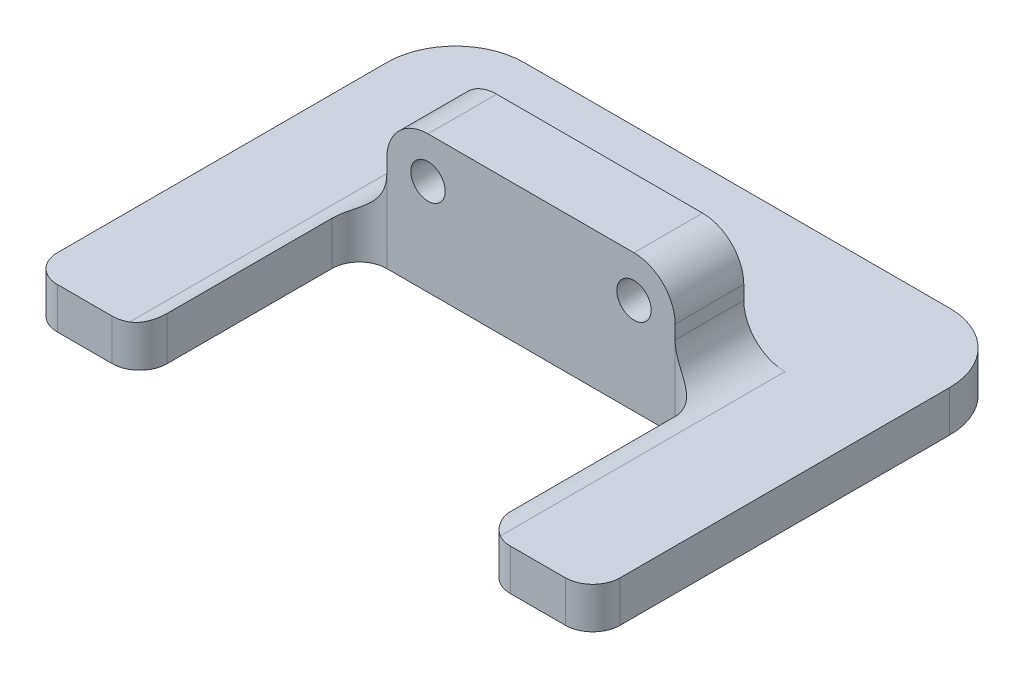
ISO-10303-21;
HEADER;
FILE_DESCRIPTION(('STEP AP214'),'2;1');
FILE_NAME('part.step','',(''),(''),'','','');
FILE_SCHEMA(('AUTOMOTIVE_DESIGN { 1 0 10303 214 1 1 1 1 }'));
ENDSEC;
DATA;
#1=APPLICATION_CONTEXT('core data for automotive mechanical design processes');
#2=APPLICATION_PROTOCOL_DEFINITION('international standard','automotive_design',2000,#1);
#3=PRODUCT_CONTEXT('',#1,'mechanical');
#4=PRODUCT('Part','Part','',(#3));
#5=PRODUCT_RELATED_PRODUCT_CATEGORY('part','',(#4));
#6=PRODUCT_DEFINITION_FORMATION('','',#4);
#7=PRODUCT_DEFINITION_CONTEXT('part definition',#1,'design');
#8=PRODUCT_DEFINITION('design','',#6,#7);
#9=PRODUCT_DEFINITION_SHAPE('','',#8);
#10=(LENGTH_UNIT() NAMED_UNIT(*) SI_UNIT(.MILLI.,.METRE.));
#11=(NAMED_UNIT(*) PLANE_ANGLE_UNIT() SI_UNIT($,.RADIAN.));
#12=(NAMED_UNIT(*) SI_UNIT($,.STERADIAN.) SOLID_ANGLE_UNIT());
#13=UNCERTAINTY_MEASURE_WITH_UNIT(LENGTH_MEASURE(1.E-05),#10,'distance_accuracy_value','');
#14=(GEOMETRIC_REPRESENTATION_CONTEXT(3) GLOBAL_UNCERTAINTY_ASSIGNED_CONTEXT((#13)) GLOBAL_UNIT_ASSIGNED_CONTEXT((#10,
#11,#12)) REPRESENTATION_CONTEXT('',''));
#15=CARTESIAN_POINT('',(0.,0.,0.));
#16=DIRECTION('',(0.,0.,1.));
#17=DIRECTION('',(1.,0.,0.));
#18=AXIS2_PLACEMENT_3D('',#15,#16,#17);
#19=CARTESIAN_POINT('',(15.,0.,0.));
#20=DIRECTION('',(0.,0.,1.));
#21=DIRECTION('',(-1.,0.,0.));
#22=AXIS2_PLACEMENT_3D('',#19,#20,#21);
#23=PLANE('',#22);
#24=DIRECTION('',(0.,1.,0.));
#25=VECTOR('',#24,1.);
#26=CARTESIAN_POINT('',(18.,-4.,0.));
#27=LINE('',#26,#25);
#28=CARTESIAN_POINT('',(18.,-1.,0.));
#29=VERTEX_POINT('',#28);
#30=CARTESIAN_POINT('',(18.,0.,0.));
#31=VERTEX_POINT('',#30);
#32=EDGE_CURVE('E216',#29,#31,#27,.T.);
#33=ORIENTED_EDGE('',*,*,#32,.T.);
#34=CARTESIAN_POINT('',(15.,0.,0.));
#35=DIRECTION('',(0.,0.,1.));
#36=DIRECTION('',(-1.,0.,0.));
#37=AXIS2_PLACEMENT_3D('',#34,#35,#36);
#38=CIRCLE('',#37,3.);
#39=CARTESIAN_POINT('',(15.,3.,0.));
#40=VERTEX_POINT('',#39);
#41=EDGE_CURVE('E234',#31,#40,#38,.T.);
#42=ORIENTED_EDGE('',*,*,#41,.T.);
#43=DIRECTION('',(-1.,0.,0.));
#44=VECTOR('',#43,1.);
#45=CARTESIAN_POINT('',(0.,3.,0.));
#46=LINE('',#45,#44);
#47=CARTESIAN_POINT('',(0.,3.,0.));
#48=VERTEX_POINT('',#47);
#49=EDGE_CURVE('E195',#40,#48,#46,.T.);
#50=ORIENTED_EDGE('',*,*,#49,.T.);
#51=CARTESIAN_POINT('',(0.,0.,0.));
#52=DIRECTION('',(0.,0.,1.));
#53=DIRECTION('',(-1.,0.,0.));
#54=AXIS2_PLACEMENT_3D('',#51,#52,#53);
#55=CIRCLE('',#54,3.);
#56=CARTESIAN_POINT('',(-3.,0.,0.));
#57=VERTEX_POINT('',#56);
#58=EDGE_CURVE('E238',#48,#57,#55,.T.);
#59=ORIENTED_EDGE('',*,*,#58,.T.);
#60=DIRECTION('',(0.,-1.,0.));
#61=VECTOR('',#60,1.);
#62=CARTESIAN_POINT('',(-3.,-4.,0.));
#63=LINE('',#62,#61);
#64=CARTESIAN_POINT('',(-3.,-1.,0.));
#65=VERTEX_POINT('',#64);
#66=EDGE_CURVE('E219',#57,#65,#63,.T.);
#67=ORIENTED_EDGE('',*,*,#66,.T.);
#68=DIRECTION('',(0.,1.,0.));
#69=VECTOR('',#68,1.);
#70=CARTESIAN_POINT('',(-3.,-3.82842712474625,0.));
#71=LINE('',#70,#69);
#72=CARTESIAN_POINT('',(-3.,-7.,0.));
#73=VERTEX_POINT('',#72);
#74=EDGE_CURVE('E719',#73,#65,#71,.T.);
#75=ORIENTED_EDGE('',*,*,#74,.F.);
#76=DIRECTION('',(1.,0.,0.));
#77=VECTOR('',#76,1.);
#78=CARTESIAN_POINT('',(-13.,-7.,0.));
#79=LINE('',#78,#77);
#80=CARTESIAN_POINT('',(18.,-7.,0.));
#81=VERTEX_POINT('',#80);
#82=EDGE_CURVE('E659',#73,#81,#79,.T.);
#83=ORIENTED_EDGE('',*,*,#82,.T.);
#84=DIRECTION('',(0.,1.,0.));
#85=VECTOR('',#84,1.);
#86=CARTESIAN_POINT('',(18.,-7.,0.));
#87=LINE('',#86,#85);
#88=EDGE_CURVE('E720',#29,#81,#87,.F.);
#89=ORIENTED_EDGE('',*,*,#88,.F.);
#90=EDGE_LOOP('',(#33,#42,#50,#59,#67,#75,#83,#89));
#91=FACE_BOUND('',#90,.T.);
#92=CARTESIAN_POINT('',(0.,0.,0.));
#93=DIRECTION('',(0.,0.,1.));
#94=DIRECTION('',(1.,0.,0.));
#95=AXIS2_PLACEMENT_3D('',#92,#93,#94);
#96=CIRCLE('',#95,1.25);
#97=CARTESIAN_POINT('',(1.25,0.,0.));
#98=VERTEX_POINT('',#97);
#99=EDGE_CURVE('E222',#98,#98,#96,.T.);
#100=ORIENTED_EDGE('',*,*,#99,.F.);
#101=EDGE_LOOP('',(#100));
#102=FACE_BOUND('',#101,.T.);
#103=CARTESIAN_POINT('',(15.,0.,0.));
#104=DIRECTION('',(0.,0.,1.));
#105=DIRECTION('',(1.,0.,0.));
#106=AXIS2_PLACEMENT_3D('',#103,#104,#105);
#107=CIRCLE('',#106,1.25);
#108=CARTESIAN_POINT('',(16.25,0.,0.));
#109=VERTEX_POINT('',#108);
#110=EDGE_CURVE('E662',#109,#109,#107,.T.);
#111=ORIENTED_EDGE('',*,*,#110,.F.);
#112=EDGE_LOOP('',(#111));
#113=FACE_BOUND('',#112,.T.);
#114=ADVANCED_FACE('F35',(#91,#102,#113),#23,.T.);
#115=CARTESIAN_POINT('',(15.,0.,-5.));
#116=DIRECTION('',(0.,0.,1.));
#117=DIRECTION('',(-1.,0.,0.));
#118=AXIS2_PLACEMENT_3D('',#115,#116,#117);
#119=PLANE('',#118);
#120=CARTESIAN_POINT('',(15.,0.,-5.));
#121=DIRECTION('',(0.,0.,1.));
#122=DIRECTION('',(-1.,0.,0.));
#123=AXIS2_PLACEMENT_3D('',#120,#121,#122);
#124=CIRCLE('',#123,3.);
#125=CARTESIAN_POINT('',(18.,0.,-5.));
#126=VERTEX_POINT('',#125);
#127=CARTESIAN_POINT('',(15.,3.,-5.));
#128=VERTEX_POINT('',#127);
#129=EDGE_CURVE('E208',#126,#128,#124,.T.);
#130=ORIENTED_EDGE('',*,*,#129,.F.);
#131=DIRECTION('',(0.,1.,0.));
#132=VECTOR('',#131,1.);
#133=CARTESIAN_POINT('',(18.,-4.,-5.));
#134=LINE('',#133,#132);
#135=CARTESIAN_POINT('',(18.,-1.,-5.));
#136=VERTEX_POINT('',#135);
#137=EDGE_CURVE('E232',#136,#126,#134,.T.);
#138=ORIENTED_EDGE('',*,*,#137,.F.);
#139=CARTESIAN_POINT('',(21.,-1.,-5.));
#140=DIRECTION('',(0.,0.,-1.));
#141=DIRECTION('',(-1.,0.,0.));
#142=AXIS2_PLACEMENT_3D('',#139,#140,#141);
#143=CIRCLE('',#142,3.);
#144=CARTESIAN_POINT('',(21.,-4.,-5.));
#145=VERTEX_POINT('',#144);
#146=EDGE_CURVE('E263',#145,#136,#143,.T.);
#147=ORIENTED_EDGE('',*,*,#146,.F.);
#148=DIRECTION('',(1.,0.,0.));
#149=VECTOR('',#148,1.);
#150=CARTESIAN_POINT('',(-3.,-4.,-5.));
#151=LINE('',#150,#149);
#152=CARTESIAN_POINT('',(-6.,-4.,-5.));
#153=VERTEX_POINT('',#152);
#154=EDGE_CURVE('E229',#153,#145,#151,.T.);
#155=ORIENTED_EDGE('',*,*,#154,.F.);
#156=CARTESIAN_POINT('',(-6.,-1.,-5.));
#157=DIRECTION('',(0.,0.,-1.));
#158=DIRECTION('',(-1.,0.,0.));
#159=AXIS2_PLACEMENT_3D('',#156,#157,#158);
#160=CIRCLE('',#159,3.);
#161=CARTESIAN_POINT('',(-3.,-1.,-5.));
#162=VERTEX_POINT('',#161);
#163=EDGE_CURVE('E257',#162,#153,#160,.T.);
#164=ORIENTED_EDGE('',*,*,#163,.F.);
#165=DIRECTION('',(0.,-1.,0.));
#166=VECTOR('',#165,1.);
#167=CARTESIAN_POINT('',(-3.,-4.,-5.));
#168=LINE('',#167,#166);
#169=CARTESIAN_POINT('',(-3.,0.,-5.));
#170=VERTEX_POINT('',#169);
#171=EDGE_CURVE('E226',#170,#162,#168,.T.);
#172=ORIENTED_EDGE('',*,*,#171,.F.);
#173=CARTESIAN_POINT('',(0.,0.,-5.));
#174=DIRECTION('',(0.,0.,1.));
#175=DIRECTION('',(-1.,0.,0.));
#176=AXIS2_PLACEMENT_3D('',#173,#174,#175);
#177=CIRCLE('',#176,3.);
#178=CARTESIAN_POINT('',(0.,3.,-5.));
#179=VERTEX_POINT('',#178);
#180=EDGE_CURVE('E211',#179,#170,#177,.T.);
#181=ORIENTED_EDGE('',*,*,#180,.F.);
#182=DIRECTION('',(-1.,0.,0.));
#183=VECTOR('',#182,1.);
#184=CARTESIAN_POINT('',(0.,3.,-5.));
#185=LINE('',#184,#183);
#186=EDGE_CURVE('E192',#128,#179,#185,.T.);
#187=ORIENTED_EDGE('',*,*,#186,.F.);
#188=EDGE_LOOP('',(#130,#138,#147,#155,#164,#172,#181,#187));
#189=FACE_BOUND('',#188,.T.);
#190=CARTESIAN_POINT('',(0.,0.,-5.));
#191=DIRECTION('',(0.,0.,1.));
#192=DIRECTION('',(1.,0.,0.));
#193=AXIS2_PLACEMENT_3D('',#190,#191,#192);
#194=CIRCLE('',#193,1.25);
#195=CARTESIAN_POINT('',(1.25,0.,-5.));
#196=VERTEX_POINT('',#195);
#197=EDGE_CURVE('E236',#196,#196,#194,.T.);
#198=ORIENTED_EDGE('',*,*,#197,.T.);
#199=EDGE_LOOP('',(#198));
#200=FACE_BOUND('',#199,.T.);
#201=CARTESIAN_POINT('',(15.,0.,-5.));
#202=DIRECTION('',(0.,0.,1.));
#203=DIRECTION('',(1.,0.,0.));
#204=AXIS2_PLACEMENT_3D('',#201,#202,#203);
#205=CIRCLE('',#204,1.25);
#206=CARTESIAN_POINT('',(16.25,0.,-5.));
#207=VERTEX_POINT('',#206);
#208=EDGE_CURVE('E677',#207,#207,#205,.T.);
#209=ORIENTED_EDGE('',*,*,#208,.T.);
#210=EDGE_LOOP('',(#209));
#211=FACE_BOUND('',#210,.T.);
#212=ADVANCED_FACE('F205',(#189,#200,#211),#119,.F.);
#213=CARTESIAN_POINT('',(15.,0.,-5.));
#214=DIRECTION('',(0.,0.,1.));
#215=DIRECTION('',(-1.,0.,0.));
#216=AXIS2_PLACEMENT_3D('',#213,#214,#215);
#217=CYLINDRICAL_SURFACE('',#216,3.);
#218=ORIENTED_EDGE('',*,*,#41,.F.);
#219=DIRECTION('',(0.,0.,1.));
#220=VECTOR('',#219,1.);
#221=CARTESIAN_POINT('',(18.,0.,-5.));
#222=LINE('',#221,#220);
#223=EDGE_CURVE('E214',#126,#31,#222,.T.);
#224=ORIENTED_EDGE('',*,*,#223,.F.);
#225=ORIENTED_EDGE('',*,*,#129,.T.);
#226=DIRECTION('',(0.,0.,1.));
#227=VECTOR('',#226,1.);
#228=CARTESIAN_POINT('',(15.,3.,-5.));
#229=LINE('',#228,#227);
#230=EDGE_CURVE('E189',#128,#40,#229,.T.);
#231=ORIENTED_EDGE('',*,*,#230,.T.);
#232=EDGE_LOOP('',(#218,#224,#225,#231));
#233=FACE_BOUND('',#232,.T.);
#234=ADVANCED_FACE('F213',(#233),#217,.T.);
#235=CARTESIAN_POINT('',(0.,3.,-5.));
#236=DIRECTION('',(0.,-1.,0.));
#237=DIRECTION('',(0.,0.,1.));
#238=AXIS2_PLACEMENT_3D('',#235,#236,#237);
#239=PLANE('',#238);
#240=ORIENTED_EDGE('',*,*,#49,.F.);
#241=ORIENTED_EDGE('',*,*,#230,.F.);
#242=ORIENTED_EDGE('',*,*,#186,.T.);
#243=DIRECTION('',(0.,0.,1.));
#244=VECTOR('',#243,1.);
#245=CARTESIAN_POINT('',(0.,3.,-5.));
#246=LINE('',#245,#244);
#247=EDGE_CURVE('E201',#179,#48,#246,.T.);
#248=ORIENTED_EDGE('',*,*,#247,.T.);
#249=EDGE_LOOP('',(#240,#241,#242,#248));
#250=FACE_BOUND('',#249,.T.);
#251=ADVANCED_FACE('F191',(#250),#239,.F.);
#252=CARTESIAN_POINT('',(0.,0.,-5.));
#253=DIRECTION('',(0.,0.,1.));
#254=DIRECTION('',(-1.,0.,0.));
#255=AXIS2_PLACEMENT_3D('',#252,#253,#254);
#256=CYLINDRICAL_SURFACE('',#255,3.);
#257=ORIENTED_EDGE('',*,*,#58,.F.);
#258=ORIENTED_EDGE('',*,*,#247,.F.);
#259=ORIENTED_EDGE('',*,*,#180,.T.);
#260=DIRECTION('',(0.,0.,1.));
#261=VECTOR('',#260,1.);
#262=CARTESIAN_POINT('',(-3.,0.,-5.));
#263=LINE('',#262,#261);
#264=EDGE_CURVE('E244',#170,#57,#263,.T.);
#265=ORIENTED_EDGE('',*,*,#264,.T.);
#266=EDGE_LOOP('',(#257,#258,#259,#265));
#267=FACE_BOUND('',#266,.T.);
#268=ADVANCED_FACE('F404',(#267),#256,.T.);
#269=CARTESIAN_POINT('',(-3.,-4.,-5.));
#270=DIRECTION('',(1.,0.,0.));
#271=DIRECTION('',(0.,0.,1.));
#272=AXIS2_PLACEMENT_3D('',#269,#270,#271);
#273=PLANE('',#272);
#274=ORIENTED_EDGE('',*,*,#66,.F.);
#275=ORIENTED_EDGE('',*,*,#264,.F.);
#276=ORIENTED_EDGE('',*,*,#171,.T.);
#277=DIRECTION('',(0.,0.,1.));
#278=VECTOR('',#277,1.);
#279=CARTESIAN_POINT('',(-3.,-1.,-5.));
#280=LINE('',#279,#278);
#281=EDGE_CURVE('E250',#65,#162,#280,.F.);
#282=ORIENTED_EDGE('',*,*,#281,.F.);
#283=EDGE_LOOP('',(#274,#275,#276,#282));
#284=FACE_BOUND('',#283,.T.);
#285=ADVANCED_FACE('F400',(#284),#273,.F.);
#286=CARTESIAN_POINT('',(18.,-4.,-5.));
#287=DIRECTION('',(-1.,0.,0.));
#288=DIRECTION('',(0.,0.,-1.));
#289=AXIS2_PLACEMENT_3D('',#286,#287,#288);
#290=PLANE('',#289);
#291=ORIENTED_EDGE('',*,*,#137,.T.);
#292=ORIENTED_EDGE('',*,*,#223,.T.);
#293=ORIENTED_EDGE('',*,*,#32,.F.);
#294=DIRECTION('',(0.,0.,1.));
#295=VECTOR('',#294,1.);
#296=CARTESIAN_POINT('',(18.,-1.,-5.));
#297=LINE('',#296,#295);
#298=EDGE_CURVE('E252',#136,#29,#297,.T.);
#299=ORIENTED_EDGE('',*,*,#298,.F.);
#300=EDGE_LOOP('',(#291,#292,#293,#299));
#301=FACE_BOUND('',#300,.T.);
#302=ADVANCED_FACE('F396',(#301),#290,.F.);
#303=CARTESIAN_POINT('',(0.,0.,-5.));
#304=DIRECTION('',(0.,0.,1.));
#305=DIRECTION('',(-1.,0.,0.));
#306=AXIS2_PLACEMENT_3D('',#303,#304,#305);
#307=CYLINDRICAL_SURFACE('',#306,1.25);
#308=ORIENTED_EDGE('',*,*,#197,.F.);
#309=EDGE_LOOP('',(#308));
#310=FACE_BOUND('',#309,.T.);
#311=ORIENTED_EDGE('',*,*,#99,.T.);
#312=EDGE_LOOP('',(#311));
#313=FACE_BOUND('',#312,.T.);
#314=ADVANCED_FACE('F399',(#310,#313),#307,.F.);
#315=CARTESIAN_POINT('',(15.,0.,-5.));
#316=DIRECTION('',(0.,0.,1.));
#317=DIRECTION('',(-1.,0.,0.));
#318=AXIS2_PLACEMENT_3D('',#315,#316,#317);
#319=CYLINDRICAL_SURFACE('',#318,1.25);
#320=ORIENTED_EDGE('',*,*,#208,.F.);
#321=EDGE_LOOP('',(#320));
#322=FACE_BOUND('',#321,.T.);
#323=ORIENTED_EDGE('',*,*,#110,.T.);
#324=EDGE_LOOP('',(#323));
#325=FACE_BOUND('',#324,.T.);
#326=ADVANCED_FACE('F456',(#322,#325),#319,.F.);
#327=CARTESIAN_POINT('',(0.,-4.,0.));
#328=DIRECTION('',(0.,1.,0.));
#329=DIRECTION('',(0.,0.,-1.));
#330=AXIS2_PLACEMENT_3D('',#327,#328,#329);
#331=PLANE('',#330);
#332=DIRECTION('',(0.,0.,-1.));
#333=VECTOR('',#332,1.);
#334=CARTESIAN_POINT('',(28.,-4.,0.));
#335=LINE('',#334,#333);
#336=CARTESIAN_POINT('',(28.,-4.,14.));
#337=VERTEX_POINT('',#336);
#338=CARTESIAN_POINT('',(28.,-4.,-10.));
#339=VERTEX_POINT('',#338);
#340=EDGE_CURVE('E656',#337,#339,#335,.T.);
#341=ORIENTED_EDGE('',*,*,#340,.T.);
#342=CARTESIAN_POINT('',(23.,-4.,-10.));
#343=DIRECTION('',(0.,-1.,0.));
#344=DIRECTION('',(0.,0.,-1.));
#345=AXIS2_PLACEMENT_3D('',#342,#343,#344);
#346=CIRCLE('',#345,5.);
#347=CARTESIAN_POINT('',(23.,-4.,-15.));
#348=VERTEX_POINT('',#347);
#349=EDGE_CURVE('E268',#348,#339,#346,.T.);
#350=ORIENTED_EDGE('',*,*,#349,.F.);
#351=DIRECTION('',(-1.,0.,0.));
#352=VECTOR('',#351,1.);
#353=CARTESIAN_POINT('',(-13.,-4.,-15.));
#354=LINE('',#353,#352);
#355=CARTESIAN_POINT('',(-8.,-4.,-15.));
#356=VERTEX_POINT('',#355);
#357=EDGE_CURVE('E674',#348,#356,#354,.T.);
#358=ORIENTED_EDGE('',*,*,#357,.T.);
#359=CARTESIAN_POINT('',(-8.,-4.,-10.));
#360=DIRECTION('',(0.,-1.,0.));
#361=DIRECTION('',(0.,0.,-1.));
#362=AXIS2_PLACEMENT_3D('',#359,#360,#361);
#363=CIRCLE('',#362,5.);
#364=CARTESIAN_POINT('',(-13.,-4.,-10.));
#365=VERTEX_POINT('',#364);
#366=EDGE_CURVE('E271',#365,#356,#363,.T.);
#367=ORIENTED_EDGE('',*,*,#366,.F.);
#368=DIRECTION('',(0.,0.,1.));
#369=VECTOR('',#368,1.);
#370=CARTESIAN_POINT('',(-13.,-4.,0.));
#371=LINE('',#370,#369);
#372=CARTESIAN_POINT('',(-13.,-4.,14.));
#373=VERTEX_POINT('',#372);
#374=EDGE_CURVE('E669',#365,#373,#371,.T.);
#375=ORIENTED_EDGE('',*,*,#374,.T.);
#376=CARTESIAN_POINT('',(-11.,-4.,14.));
#377=DIRECTION('',(0.,-1.,0.));
#378=DIRECTION('',(0.,0.,-1.));
#379=AXIS2_PLACEMENT_3D('',#376,#377,#378);
#380=CIRCLE('',#379,2.);
#381=CARTESIAN_POINT('',(-11.,-4.,16.));
#382=VERTEX_POINT('',#381);
#383=EDGE_CURVE('E288',#382,#373,#380,.T.);
#384=ORIENTED_EDGE('',*,*,#383,.F.);
#385=DIRECTION('',(-1.,0.,0.));
#386=VECTOR('',#385,1.);
#387=CARTESIAN_POINT('',(-13.,-4.,16.));
#388=LINE('',#387,#386);
#389=CARTESIAN_POINT('',(-7.,-4.,16.));
#390=VERTEX_POINT('',#389);
#391=EDGE_CURVE('E698',#390,#382,#388,.T.);
#392=ORIENTED_EDGE('',*,*,#391,.F.);
#393=CARTESIAN_POINT('',(-7.,-4.,14.));
#394=DIRECTION('',(0.,-1.,0.));
#395=DIRECTION('',(0.,0.,-1.));
#396=AXIS2_PLACEMENT_3D('',#393,#394,#395);
#397=CIRCLE('',#396,2.);
#398=CARTESIAN_POINT('',(-6.,-4.,15.7320508075689));
#399=VERTEX_POINT('',#398);
#400=EDGE_CURVE('E291',#399,#390,#397,.T.);
#401=ORIENTED_EDGE('',*,*,#400,.F.);
#402=DIRECTION('',(0.,0.,1.));
#403=VECTOR('',#402,1.);
#404=CARTESIAN_POINT('',(-6.,-4.,0.));
#405=LINE('',#404,#403);
#406=EDGE_CURVE('E248',#153,#399,#405,.T.);
#407=ORIENTED_EDGE('',*,*,#406,.F.);
#408=ORIENTED_EDGE('',*,*,#154,.T.);
#409=DIRECTION('',(0.,0.,1.));
#410=VECTOR('',#409,1.);
#411=CARTESIAN_POINT('',(21.,-4.,0.));
#412=LINE('',#411,#410);
#413=CARTESIAN_POINT('',(21.,-4.,15.7320508075689));
#414=VERTEX_POINT('',#413);
#415=EDGE_CURVE('E200',#414,#145,#412,.F.);
#416=ORIENTED_EDGE('',*,*,#415,.F.);
#417=CARTESIAN_POINT('',(22.,-4.,14.));
#418=DIRECTION('',(0.,-1.,0.));
#419=DIRECTION('',(0.,0.,-1.));
#420=AXIS2_PLACEMENT_3D('',#417,#418,#419);
#421=CIRCLE('',#420,2.);
#422=CARTESIAN_POINT('',(22.,-4.,16.));
#423=VERTEX_POINT('',#422);
#424=EDGE_CURVE('E294',#423,#414,#421,.T.);
#425=ORIENTED_EDGE('',*,*,#424,.F.);
#426=DIRECTION('',(-1.,0.,0.));
#427=VECTOR('',#426,1.);
#428=CARTESIAN_POINT('',(28.,-4.,16.));
#429=LINE('',#428,#427);
#430=CARTESIAN_POINT('',(26.,-4.,16.));
#431=VERTEX_POINT('',#430);
#432=EDGE_CURVE('E709',#431,#423,#429,.T.);
#433=ORIENTED_EDGE('',*,*,#432,.F.);
#434=CARTESIAN_POINT('',(26.,-4.,14.));
#435=DIRECTION('',(0.,-1.,0.));
#436=DIRECTION('',(0.,0.,-1.));
#437=AXIS2_PLACEMENT_3D('',#434,#435,#436);
#438=CIRCLE('',#437,2.);
#439=EDGE_CURVE('E297',#337,#431,#438,.T.);
#440=ORIENTED_EDGE('',*,*,#439,.F.);
#441=EDGE_LOOP('',(#341,#350,#358,#367,#375,#384,#392,#401,#407,#408,#416,#425,#433,#440));
#442=FACE_BOUND('',#441,.T.);
#443=ADVANCED_FACE('F464',(#442),#331,.T.);
#444=CARTESIAN_POINT('',(-13.,-7.,0.));
#445=DIRECTION('',(1.,0.,0.));
#446=DIRECTION('',(0.,0.,1.));
#447=AXIS2_PLACEMENT_3D('',#444,#445,#446);
#448=PLANE('',#447);
#449=ORIENTED_EDGE('',*,*,#374,.F.);
#450=DIRECTION('',(0.,1.,0.));
#451=VECTOR('',#450,1.);
#452=CARTESIAN_POINT('',(-13.,-7.,-10.));
#453=LINE('',#452,#451);
#454=CARTESIAN_POINT('',(-13.,-7.,-10.));
#455=VERTEX_POINT('',#454);
#456=EDGE_CURVE('E266',#455,#365,#453,.T.);
#457=ORIENTED_EDGE('',*,*,#456,.F.);
#458=DIRECTION('',(0.,0.,1.));
#459=VECTOR('',#458,1.);
#460=CARTESIAN_POINT('',(-13.,-7.,0.));
#461=LINE('',#460,#459);
#462=CARTESIAN_POINT('',(-13.,-7.,14.));
#463=VERTEX_POINT('',#462);
#464=EDGE_CURVE('E665',#455,#463,#461,.T.);
#465=ORIENTED_EDGE('',*,*,#464,.T.);
#466=DIRECTION('',(0.,1.,0.));
#467=VECTOR('',#466,1.);
#468=CARTESIAN_POINT('',(-13.,-7.,14.));
#469=LINE('',#468,#467);
#470=EDGE_CURVE('E353',#373,#463,#469,.F.);
#471=ORIENTED_EDGE('',*,*,#470,.F.);
#472=EDGE_LOOP('',(#449,#457,#465,#471));
#473=FACE_BOUND('',#472,.T.);
#474=ADVANCED_FACE('F473',(#473),#448,.F.);
#475=CARTESIAN_POINT('',(28.,-7.,0.));
#476=DIRECTION('',(-1.,0.,0.));
#477=DIRECTION('',(0.,0.,-1.));
#478=AXIS2_PLACEMENT_3D('',#475,#476,#477);
#479=PLANE('',#478);
#480=DIRECTION('',(0.,0.,-1.));
#481=VECTOR('',#480,1.);
#482=CARTESIAN_POINT('',(28.,-7.,0.));
#483=LINE('',#482,#481);
#484=CARTESIAN_POINT('',(28.,-7.,14.));
#485=VERTEX_POINT('',#484);
#486=CARTESIAN_POINT('',(28.,-7.,-10.));
#487=VERTEX_POINT('',#486);
#488=EDGE_CURVE('E654',#485,#487,#483,.T.);
#489=ORIENTED_EDGE('',*,*,#488,.T.);
#490=DIRECTION('',(0.,1.,0.));
#491=VECTOR('',#490,1.);
#492=CARTESIAN_POINT('',(28.,-7.,-10.));
#493=LINE('',#492,#491);
#494=EDGE_CURVE('E283',#339,#487,#493,.F.);
#495=ORIENTED_EDGE('',*,*,#494,.F.);
#496=ORIENTED_EDGE('',*,*,#340,.F.);
#497=DIRECTION('',(0.,1.,0.));
#498=VECTOR('',#497,1.);
#499=CARTESIAN_POINT('',(28.,-4.,14.));
#500=LINE('',#499,#498);
#501=EDGE_CURVE('E286',#485,#337,#500,.T.);
#502=ORIENTED_EDGE('',*,*,#501,.F.);
#503=EDGE_LOOP('',(#489,#495,#496,#502));
#504=FACE_BOUND('',#503,.T.);
#505=ADVANCED_FACE('F488',(#504),#479,.F.);
#506=CARTESIAN_POINT('',(-13.,-7.,-15.));
#507=DIRECTION('',(0.,0.,1.));
#508=DIRECTION('',(-1.,0.,0.));
#509=AXIS2_PLACEMENT_3D('',#506,#507,#508);
#510=PLANE('',#509);
#511=ORIENTED_EDGE('',*,*,#357,.F.);
#512=DIRECTION('',(0.,1.,0.));
#513=VECTOR('',#512,1.);
#514=CARTESIAN_POINT('',(23.,-7.,-15.));
#515=LINE('',#514,#513);
#516=CARTESIAN_POINT('',(23.,-7.,-15.));
#517=VERTEX_POINT('',#516);
#518=EDGE_CURVE('E274',#517,#348,#515,.T.);
#519=ORIENTED_EDGE('',*,*,#518,.F.);
#520=DIRECTION('',(-1.,0.,0.));
#521=VECTOR('',#520,1.);
#522=CARTESIAN_POINT('',(-13.,-7.,-15.));
#523=LINE('',#522,#521);
#524=CARTESIAN_POINT('',(-8.,-7.,-15.));
#525=VERTEX_POINT('',#524);
#526=EDGE_CURVE('E658',#517,#525,#523,.T.);
#527=ORIENTED_EDGE('',*,*,#526,.T.);
#528=DIRECTION('',(0.,1.,0.));
#529=VECTOR('',#528,1.);
#530=CARTESIAN_POINT('',(-8.,-7.,-15.));
#531=LINE('',#530,#529);
#532=EDGE_CURVE('E276',#356,#525,#531,.F.);
#533=ORIENTED_EDGE('',*,*,#532,.F.);
#534=EDGE_LOOP('',(#511,#519,#527,#533));
#535=FACE_BOUND('',#534,.T.);
#536=ADVANCED_FACE('F500',(#535),#510,.F.);
#537=CARTESIAN_POINT('',(0.,-7.,0.));
#538=DIRECTION('',(0.,1.,0.));
#539=DIRECTION('',(0.,0.,-1.));
#540=AXIS2_PLACEMENT_3D('',#537,#538,#539);
#541=PLANE('',#540);
#542=DIRECTION('',(1.,0.,0.));
#543=VECTOR('',#542,1.);
#544=CARTESIAN_POINT('',(28.,-7.,16.));
#545=LINE('',#544,#543);
#546=CARTESIAN_POINT('',(22.,-7.,16.));
#547=VERTEX_POINT('',#546);
#548=CARTESIAN_POINT('',(26.,-7.,16.));
#549=VERTEX_POINT('',#548);
#550=EDGE_CURVE('E702',#547,#549,#545,.T.);
#551=ORIENTED_EDGE('',*,*,#550,.F.);
#552=CARTESIAN_POINT('',(22.,-7.,14.));
#553=DIRECTION('',(0.,-1.,0.));
#554=DIRECTION('',(0.,0.,-1.));
#555=AXIS2_PLACEMENT_3D('',#552,#553,#554);
#556=CIRCLE('',#555,2.);
#557=CARTESIAN_POINT('',(20.,-7.,14.));
#558=VERTEX_POINT('',#557);
#559=EDGE_CURVE('E310',#558,#547,#556,.F.);
#560=ORIENTED_EDGE('',*,*,#559,.F.);
#561=DIRECTION('',(0.,0.,1.));
#562=VECTOR('',#561,1.);
#563=CARTESIAN_POINT('',(20.,-7.,0.));
#564=LINE('',#563,#562);
#565=CARTESIAN_POINT('',(20.,-7.,2.));
#566=VERTEX_POINT('',#565);
#567=EDGE_CURVE('E708',#566,#558,#564,.T.);
#568=ORIENTED_EDGE('',*,*,#567,.F.);
#569=CARTESIAN_POINT('',(18.,-7.,2.));
#570=DIRECTION('',(0.,-1.,0.));
#571=DIRECTION('',(0.,0.,-1.));
#572=AXIS2_PLACEMENT_3D('',#569,#570,#571);
#573=CIRCLE('',#572,2.);
#574=EDGE_CURVE('E352',#81,#566,#573,.T.);
#575=ORIENTED_EDGE('',*,*,#574,.F.);
#576=ORIENTED_EDGE('',*,*,#82,.F.);
#577=CARTESIAN_POINT('',(-3.,-7.,2.));
#578=DIRECTION('',(0.,-1.,0.));
#579=DIRECTION('',(0.,0.,-1.));
#580=AXIS2_PLACEMENT_3D('',#577,#578,#579);
#581=CIRCLE('',#580,2.);
#582=CARTESIAN_POINT('',(-5.,-7.,2.));
#583=VERTEX_POINT('',#582);
#584=EDGE_CURVE('E11',#583,#73,#581,.T.);
#585=ORIENTED_EDGE('',*,*,#584,.F.);
#586=DIRECTION('',(0.,0.,-1.));
#587=VECTOR('',#586,1.);
#588=CARTESIAN_POINT('',(-5.,-7.,0.));
#589=LINE('',#588,#587);
#590=CARTESIAN_POINT('',(-5.,-7.,14.));
#591=VERTEX_POINT('',#590);
#592=EDGE_CURVE('E701',#591,#583,#589,.T.);
#593=ORIENTED_EDGE('',*,*,#592,.F.);
#594=CARTESIAN_POINT('',(-7.,-7.,14.));
#595=DIRECTION('',(0.,-1.,0.));
#596=DIRECTION('',(0.,0.,-1.));
#597=AXIS2_PLACEMENT_3D('',#594,#595,#596);
#598=CIRCLE('',#597,2.);
#599=CARTESIAN_POINT('',(-7.,-7.,16.));
#600=VERTEX_POINT('',#599);
#601=EDGE_CURVE('E307',#600,#591,#598,.F.);
#602=ORIENTED_EDGE('',*,*,#601,.F.);
#603=DIRECTION('',(1.,0.,0.));
#604=VECTOR('',#603,1.);
#605=CARTESIAN_POINT('',(-13.,-7.,16.));
#606=LINE('',#605,#604);
#607=CARTESIAN_POINT('',(-11.,-7.,16.));
#608=VERTEX_POINT('',#607);
#609=EDGE_CURVE('E672',#608,#600,#606,.T.);
#610=ORIENTED_EDGE('',*,*,#609,.F.);
#611=CARTESIAN_POINT('',(-11.,-7.,14.));
#612=DIRECTION('',(0.,-1.,0.));
#613=DIRECTION('',(0.,0.,-1.));
#614=AXIS2_PLACEMENT_3D('',#611,#612,#613);
#615=CIRCLE('',#614,2.);
#616=EDGE_CURVE('E304',#463,#608,#615,.F.);
#617=ORIENTED_EDGE('',*,*,#616,.F.);
#618=ORIENTED_EDGE('',*,*,#464,.F.);
#619=CARTESIAN_POINT('',(-8.,-7.,-10.));
#620=DIRECTION('',(0.,-1.,0.));
#621=DIRECTION('',(0.,0.,-1.));
#622=AXIS2_PLACEMENT_3D('',#619,#620,#621);
#623=CIRCLE('',#622,5.);
#624=EDGE_CURVE('E281',#525,#455,#623,.F.);
#625=ORIENTED_EDGE('',*,*,#624,.F.);
#626=ORIENTED_EDGE('',*,*,#526,.F.);
#627=CARTESIAN_POINT('',(23.,-7.,-10.));
#628=DIRECTION('',(0.,-1.,0.));
#629=DIRECTION('',(0.,0.,-1.));
#630=AXIS2_PLACEMENT_3D('',#627,#628,#629);
#631=CIRCLE('',#630,5.);
#632=EDGE_CURVE('E279',#487,#517,#631,.F.);
#633=ORIENTED_EDGE('',*,*,#632,.F.);
#634=ORIENTED_EDGE('',*,*,#488,.F.);
#635=CARTESIAN_POINT('',(26.,-7.,14.));
#636=DIRECTION('',(0.,-1.,0.));
#637=DIRECTION('',(0.,0.,-1.));
#638=AXIS2_PLACEMENT_3D('',#635,#636,#637);
#639=CIRCLE('',#638,2.);
#640=EDGE_CURVE('E313',#549,#485,#639,.F.);
#641=ORIENTED_EDGE('',*,*,#640,.F.);
#642=EDGE_LOOP('',(#551,#560,#568,#575,#576,#585,#593,#602,#610,#617,#618,#625,#626,#633,#634,#641));
#643=FACE_BOUND('',#642,.T.);
#644=ADVANCED_FACE('F512',(#643),#541,.F.);
#645=CARTESIAN_POINT('',(-13.,-24.8885438199983,16.));
#646=DIRECTION('',(0.,0.,1.));
#647=DIRECTION('',(-1.,0.,0.));
#648=AXIS2_PLACEMENT_3D('',#645,#646,#647);
#649=PLANE('',#648);
#650=ORIENTED_EDGE('',*,*,#391,.T.);
#651=DIRECTION('',(0.,1.,0.));
#652=VECTOR('',#651,1.);
#653=CARTESIAN_POINT('',(-11.,-4.,16.));
#654=LINE('',#653,#652);
#655=EDGE_CURVE('E374',#608,#382,#654,.T.);
#656=ORIENTED_EDGE('',*,*,#655,.F.);
#657=ORIENTED_EDGE('',*,*,#609,.T.);
#658=DIRECTION('',(0.,1.,0.));
#659=VECTOR('',#658,1.);
#660=CARTESIAN_POINT('',(-7.,-24.8885438199983,16.));
#661=LINE('',#660,#659);
#662=EDGE_CURVE('E743',#390,#600,#661,.F.);
#663=ORIENTED_EDGE('',*,*,#662,.F.);
#664=EDGE_LOOP('',(#650,#656,#657,#663));
#665=FACE_BOUND('',#664,.T.);
#666=ADVANCED_FACE('F521',(#665),#649,.T.);
#667=CARTESIAN_POINT('',(-5.,-24.8885438199983,0.));
#668=DIRECTION('',(1.,0.,0.));
#669=DIRECTION('',(0.,0.,1.));
#670=AXIS2_PLACEMENT_3D('',#667,#668,#669);
#671=PLANE('',#670);
#672=DIRECTION('',(0.,0.,1.));
#673=VECTOR('',#672,1.);
#674=CARTESIAN_POINT('',(-5.,-3.82842712474625,16.));
#675=LINE('',#674,#673);
#676=CARTESIAN_POINT('',(-5.,-3.82842712474625,14.));
#677=VERTEX_POINT('',#676);
#678=CARTESIAN_POINT('',(-5.,-3.82842712474625,2.));
#679=VERTEX_POINT('',#678);
#680=EDGE_CURVE('E255',#677,#679,#675,.F.);
#681=ORIENTED_EDGE('',*,*,#680,.F.);
#682=DIRECTION('',(0.,1.,0.));
#683=VECTOR('',#682,1.);
#684=CARTESIAN_POINT('',(-5.,-24.8885438199983,14.));
#685=LINE('',#684,#683);
#686=EDGE_CURVE('E724',#591,#677,#685,.T.);
#687=ORIENTED_EDGE('',*,*,#686,.F.);
#688=ORIENTED_EDGE('',*,*,#592,.T.);
#689=DIRECTION('',(0.,1.,0.));
#690=VECTOR('',#689,1.);
#691=CARTESIAN_POINT('',(-5.,-7.,2.));
#692=LINE('',#691,#690);
#693=EDGE_CURVE('E375',#679,#583,#692,.F.);
#694=ORIENTED_EDGE('',*,*,#693,.F.);
#695=EDGE_LOOP('',(#681,#687,#688,#694));
#696=FACE_BOUND('',#695,.T.);
#697=ADVANCED_FACE('F536',(#696),#671,.T.);
#698=CARTESIAN_POINT('',(20.,-24.8885438199983,0.));
#699=DIRECTION('',(-1.,0.,0.));
#700=DIRECTION('',(0.,0.,-1.));
#701=AXIS2_PLACEMENT_3D('',#698,#699,#700);
#702=PLANE('',#701);
#703=DIRECTION('',(0.,0.,1.));
#704=VECTOR('',#703,1.);
#705=CARTESIAN_POINT('',(20.,-3.82842712474624,0.));
#706=LINE('',#705,#704);
#707=CARTESIAN_POINT('',(20.,-3.82842712474624,2.));
#708=VERTEX_POINT('',#707);
#709=CARTESIAN_POINT('',(20.,-3.82842712474624,14.));
#710=VERTEX_POINT('',#709);
#711=EDGE_CURVE('E260',#708,#710,#706,.T.);
#712=ORIENTED_EDGE('',*,*,#711,.F.);
#713=DIRECTION('',(0.,1.,0.));
#714=VECTOR('',#713,1.);
#715=CARTESIAN_POINT('',(20.,-3.82842712474624,2.));
#716=LINE('',#715,#714);
#717=EDGE_CURVE('E323',#566,#708,#716,.T.);
#718=ORIENTED_EDGE('',*,*,#717,.F.);
#719=ORIENTED_EDGE('',*,*,#567,.T.);
#720=DIRECTION('',(0.,1.,0.));
#721=VECTOR('',#720,1.);
#722=CARTESIAN_POINT('',(20.,-24.8885438199983,14.));
#723=LINE('',#722,#721);
#724=EDGE_CURVE('E717',#710,#558,#723,.F.);
#725=ORIENTED_EDGE('',*,*,#724,.F.);
#726=EDGE_LOOP('',(#712,#718,#719,#725));
#727=FACE_BOUND('',#726,.T.);
#728=ADVANCED_FACE('F545',(#727),#702,.T.);
#729=CARTESIAN_POINT('',(28.,-24.8885438199983,16.));
#730=DIRECTION('',(0.,0.,1.));
#731=DIRECTION('',(-1.,0.,0.));
#732=AXIS2_PLACEMENT_3D('',#729,#730,#731);
#733=PLANE('',#732);
#734=ORIENTED_EDGE('',*,*,#432,.T.);
#735=DIRECTION('',(0.,1.,0.));
#736=VECTOR('',#735,1.);
#737=CARTESIAN_POINT('',(22.,-24.8885438199983,16.));
#738=LINE('',#737,#736);
#739=EDGE_CURVE('E300',#547,#423,#738,.T.);
#740=ORIENTED_EDGE('',*,*,#739,.F.);
#741=ORIENTED_EDGE('',*,*,#550,.T.);
#742=DIRECTION('',(0.,1.,0.));
#743=VECTOR('',#742,1.);
#744=CARTESIAN_POINT('',(26.,-7.,16.));
#745=LINE('',#744,#743);
#746=EDGE_CURVE('E302',#431,#549,#745,.F.);
#747=ORIENTED_EDGE('',*,*,#746,.F.);
#748=EDGE_LOOP('',(#734,#740,#741,#747));
#749=FACE_BOUND('',#748,.T.);
#750=ADVANCED_FACE('F364',(#749),#733,.T.);
#751=CARTESIAN_POINT('',(-6.,-1.,0.));
#752=DIRECTION('',(0.,0.,1.));
#753=DIRECTION('',(-1.,0.,0.));
#754=AXIS2_PLACEMENT_3D('',#751,#752,#753);
#755=CYLINDRICAL_SURFACE('',#754,3.);
#756=ORIENTED_EDGE('',*,*,#680,.T.);
#757=CARTESIAN_POINT('',(-3.,-1.,0.));
#758=CARTESIAN_POINT('',(-2.99999081844046,-1.08468057991087,4.08070034306521E-05));
#759=CARTESIAN_POINT('',(-3.00358502848274,-1.16935984299454,1.27835970598177E-06));
#760=CARTESIAN_POINT('',(-3.01791476964296,-1.338119549342,5.65012641626756E-05));
#761=CARTESIAN_POINT('',(-3.02865092870103,-1.42219993929414,0.000151264620500521));
#762=CARTESIAN_POINT('',(-3.05729332648929,-1.58970174068187,0.000772162532402998));
#763=CARTESIAN_POINT('',(-3.07524643651899,-1.67311513617932,0.00130114101613216));
#764=CARTESIAN_POINT('',(-3.11818494576128,-1.83809659216666,0.00337855864146647));
#765=CARTESIAN_POINT('',(-3.14316995402086,-1.91966475497379,0.00492694111359556));
#766=CARTESIAN_POINT('',(-3.19972713561523,-2.07963192891732,0.0097974506784253));
#767=CARTESIAN_POINT('',(-3.23123972487629,-2.15805243336397,0.0131039303784691));
#768=CARTESIAN_POINT('',(-3.30069623124199,-2.31182116914053,0.0224233251806503));
#769=CARTESIAN_POINT('',(-3.33863919680813,-2.38716985298129,0.0284358400733516));
#770=CARTESIAN_POINT('',(-3.42039578430527,-2.53383781854975,0.0442411613398568));
#771=CARTESIAN_POINT('',(-3.46418631950306,-2.60517145311518,0.0540193727209806));
#772=CARTESIAN_POINT('',(-3.55709797012513,-2.74331923223528,0.0785553331548114));
#773=CARTESIAN_POINT('',(-3.60621609811189,-2.81013587590906,0.09331030119415));
#774=CARTESIAN_POINT('',(-3.72644449064535,-2.96036847402638,0.135170718817197));
#775=CARTESIAN_POINT('',(-3.79935240550658,-3.04170009515619,0.164769986464137));
#776=CARTESIAN_POINT('',(-3.94991970666177,-3.19283794734629,0.238002315579784));
#777=CARTESIAN_POINT('',(-4.02757553149147,-3.26265267545136,0.281624960041121));
#778=CARTESIAN_POINT('',(-4.18356921035068,-3.38972050895516,0.385082520904076));
#779=CARTESIAN_POINT('',(-4.26190821091273,-3.44688878069924,0.445021245125527));
#780=CARTESIAN_POINT('',(-4.41315020340085,-3.54758450888201,0.581081902238124));
#781=CARTESIAN_POINT('',(-4.48605436171465,-3.59111489864708,0.657200349166925));
#782=CARTESIAN_POINT('',(-4.61396154827047,-3.66151793977056,0.814949901252832));
#783=CARTESIAN_POINT('',(-4.67004207472746,-3.68966458158605,0.895149014407888));
#784=CARTESIAN_POINT('',(-4.77068058062243,-3.73713000522794,1.06489323914979));
#785=CARTESIAN_POINT('',(-4.81523378555883,-3.75644513166184,1.15444220186677));
#786=CARTESIAN_POINT('',(-4.89062757014722,-3.7876443203711,1.34003742436189));
#787=CARTESIAN_POINT('',(-4.92150208152069,-3.7995468007756,1.43606691796425));
#788=CARTESIAN_POINT('',(-4.96845166141496,-3.81718754983315,1.63212841162731));
#789=CARTESIAN_POINT('',(-4.98454876903728,-3.82293500027123,1.73215421828837));
#790=CARTESIAN_POINT('',(-4.99533244902172,-3.82677253231539,1.86059558286367));
#791=CARTESIAN_POINT('',(-4.99708359824896,-3.82739424707241,1.88846715741564));
#792=CARTESIAN_POINT('',(-4.99941577902837,-3.82822112635189,1.94422253892553));
#793=CARTESIAN_POINT('',(-4.99999860329149,-3.82842692906555,1.97210626137568));
#794=CARTESIAN_POINT('',(-5.,-3.82842712474619,2.));
#795=B_SPLINE_CURVE_WITH_KNOTS('',3,(#757,#758,#759,#760,#761,#762,#763,#764,#765,#766,#767,
#768,#769,#770,#771,#772,#773,#774,#775,#776,#777,#778,#779,#780,#781,#782,#783,#784,#785,#786,
#787,#788,#789,#790,#791,#792,#793,#794),.UNSPECIFIED.,.F.,.F.,(4,2,2,2,2,2,2,2,2,2,2,2,2,2,2,2,
2,2,4),(0.,0.253963590261567,0.507949512664211,0.763612336281237,1.0192609485991,
1.27267141765619,1.52604442084744,1.77844513285816,2.03070503628705,2.36876911822807,
2.7065826535299,3.04659783092807,3.38653982531267,3.69056771212811,3.99472132339932,
4.29811616010172,4.60105777345976,4.68484074777505,4.76849506441024),.UNSPECIFIED.);
#796=EDGE_CURVE('E43',#65,#679,#795,.T.);
#797=ORIENTED_EDGE('',*,*,#796,.F.);
#798=ORIENTED_EDGE('',*,*,#281,.T.);
#799=ORIENTED_EDGE('',*,*,#163,.T.);
#800=ORIENTED_EDGE('',*,*,#406,.T.);
#801=CARTESIAN_POINT('',(-5.,-3.82842712474625,14.));
#802=CARTESIAN_POINT('',(-4.99999265806744,-3.82841182400506,14.0550781443512));
#803=CARTESIAN_POINT('',(-5.00227500591609,-3.82923117584639,14.1101500412768));
#804=CARTESIAN_POINT('',(-5.01136111584483,-3.83242569745194,14.2198545591851));
#805=CARTESIAN_POINT('',(-5.01816321990644,-3.83480029668771,14.2744873338191));
#806=CARTESIAN_POINT('',(-5.0361980138943,-3.84098069178117,14.3827301025215));
#807=CARTESIAN_POINT('',(-5.04741445783428,-3.84478123739696,14.4363430996268));
#808=CARTESIAN_POINT('',(-5.07416707223557,-3.85359959007776,14.5423653209714));
#809=CARTESIAN_POINT('',(-5.08970350307169,-3.85861747051181,14.5947744724462));
#810=CARTESIAN_POINT('',(-5.14257832660738,-3.87510102498306,14.7495615693944));
#811=CARTESIAN_POINT('',(-5.18621778846857,-3.88801038075264,14.8497100001151));
#812=CARTESIAN_POINT('',(-5.28914341782373,-3.91504713179848,15.0415650897109));
#813=CARTESIAN_POINT('',(-5.34845525174275,-3.9291764992807,15.1332575650193));
#814=CARTESIAN_POINT('',(-5.48385826583204,-3.95610303069603,15.309236919));
#815=CARTESIAN_POINT('',(-5.5604977473639,-3.968829884862,15.3931142625969));
#816=CARTESIAN_POINT('',(-5.72713103404349,-3.98873065956576,15.5467909753149));
#817=CARTESIAN_POINT('',(-5.81708101677128,-3.9959223392079,15.6166348321069));
#818=CARTESIAN_POINT('',(-5.9410464530328,-3.99956180739713,15.6970011035699));
#819=CARTESIAN_POINT('',(-5.97030509276333,-4.00000476420336,15.7149153152082));
#820=CARTESIAN_POINT('',(-6.,-4.,15.7320508075689));
#821=B_SPLINE_CURVE_WITH_KNOTS('',3,(#801,#802,#803,#804,#805,#806,#807,#808,#809,#810,#811,
#812,#813,#814,#815,#816,#817,#818,#819,#820),.UNSPECIFIED.,.F.,.F.,(4,2,2,2,2,2,2,2,2,4),(0.,
0.165170648534212,0.330280739618907,0.49478877858866,0.659306734958521,0.987707896978204,
1.31665024663155,1.65799423936293,1.99823844213363,2.1011137942272),.UNSPECIFIED.);
#822=EDGE_CURVE('E57',#677,#399,#821,.T.);
#823=ORIENTED_EDGE('',*,*,#822,.F.);
#824=EDGE_LOOP('',(#756,#797,#798,#799,#800,#823));
#825=FACE_BOUND('',#824,.T.);
#826=ADVANCED_FACE('F360',(#825),#755,.F.);
#827=CARTESIAN_POINT('',(21.,-1.,-5.));
#828=DIRECTION('',(0.,0.,1.));
#829=DIRECTION('',(-1.,0.,0.));
#830=AXIS2_PLACEMENT_3D('',#827,#828,#829);
#831=CYLINDRICAL_SURFACE('',#830,3.);
#832=ORIENTED_EDGE('',*,*,#415,.T.);
#833=ORIENTED_EDGE('',*,*,#146,.T.);
#834=ORIENTED_EDGE('',*,*,#298,.T.);
#835=CARTESIAN_POINT('',(20.,-3.82842712474624,2.));
#836=CARTESIAN_POINT('',(20.0000062549477,-3.82841883159369,1.94776670031488));
#837=CARTESIAN_POINT('',(19.9979537904565,-3.82770339697815,1.89553482490736));
#838=CARTESIAN_POINT('',(19.9897784451226,-3.82479856674602,1.79142904833881));
#839=CARTESIAN_POINT('',(19.9836553408299,-3.82260909021461,1.73955516698713));
#840=CARTESIAN_POINT('',(19.9673795881845,-3.81669424729348,1.63648730953953));
#841=CARTESIAN_POINT('',(19.9572238920513,-3.81296771913737,1.58529387803257));
#842=CARTESIAN_POINT('',(19.9329948932204,-3.80386619567858,1.48400864029209));
#843=CARTESIAN_POINT('',(19.9189217230762,-3.7984912561517,1.4339167968466));
#844=CARTESIAN_POINT('',(19.8709745390262,-3.779658877106,1.28571110417774));
#845=CARTESIAN_POINT('',(19.8313781710168,-3.76349557769522,1.18970032571394));
#846=CARTESIAN_POINT('',(19.7388285450568,-3.72249609569527,1.00651920066198));
#847=CARTESIAN_POINT('',(19.685888458311,-3.69766845619051,0.919340254693921));
#848=CARTESIAN_POINT('',(19.5707259260031,-3.6384198299955,0.758060353660886));
#849=CARTESIAN_POINT('',(19.5087335128758,-3.60422209530026,0.683713720216297));
#850=CARTESIAN_POINT('',(19.3782102103922,-3.52499622912358,0.547612240038171));
#851=CARTESIAN_POINT('',(19.3096795990031,-3.47996855794615,0.48585685834564));
#852=CARTESIAN_POINT('',(19.1716794129466,-3.37998714014158,0.376809790076924));
#853=CARTESIAN_POINT('',(19.1022618536933,-3.32526807410112,0.329235226792285));
#854=CARTESIAN_POINT('',(18.9647526956805,-3.20591559558049,0.246228182653852));
#855=CARTESIAN_POINT('',(18.896661487988,-3.14127930747435,0.210799233245097));
#856=CARTESIAN_POINT('',(18.7595971936423,-2.99779886629087,0.14820614633027));
#857=CARTESIAN_POINT('',(18.6909828252078,-2.91823431071669,0.121920847328399));
#858=CARTESIAN_POINT('',(18.5614721585319,-2.75066420926279,0.0792166223168573));
#859=CARTESIAN_POINT('',(18.5005804083939,-2.66265374240914,0.0628034892519675));
#860=CARTESIAN_POINT('',(18.3768609991015,-2.46142370610963,0.0346030150756054));
#861=CARTESIAN_POINT('',(18.3161218420324,-2.3467007648254,0.0244172859833018));
#862=CARTESIAN_POINT('',(18.2098581127502,-2.1099442224266,0.0103153697614551));
#863=CARTESIAN_POINT('',(18.1643502962157,-1.98790274317125,0.00640606937323047));
#864=CARTESIAN_POINT('',(18.1059275700746,-1.79353022146242,0.00269933759694706));
#865=CARTESIAN_POINT('',(18.0874664008221,-1.72283131544674,0.00185097504550795));
#866=CARTESIAN_POINT('',(18.0557450115567,-1.58025250348824,0.000713535473784186));
#867=CARTESIAN_POINT('',(18.0424853259604,-1.5083724769835,0.000424515910144147));
#868=CARTESIAN_POINT('',(18.0212631091873,-1.36393330020273,8.35010414059094E-05));
#869=CARTESIAN_POINT('',(18.0132936939061,-1.29137515759206,3.11971857493369E-05));
#870=CARTESIAN_POINT('',(18.0026600908288,-1.14587864991864,6.16971501278521E-07));
#871=CARTESIAN_POINT('',(17.9999953617685,-1.07294032440941,2.23330596628499E-05));
#872=CARTESIAN_POINT('',(18.,-0.999999999999999,0.));
#873=B_SPLINE_CURVE_WITH_KNOTS('',3,(#835,#836,#837,#838,#839,#840,#841,#842,#843,#844,#845,
#846,#847,#848,#849,#850,#851,#852,#853,#854,#855,#856,#857,#858,#859,#860,#861,#862,#863,#864,
#865,#866,#867,#868,#869,#870,#871,#872),.UNSPECIFIED.,.F.,.F.,(4,2,2,2,2,2,2,2,2,2,2,2,2,2,2,2,
2,2,4),(0.,0.156651892658513,0.31331238513598,0.470091505632049,0.626865321921279,
0.940512776720224,1.25385184321967,1.56029212014134,1.86671937475498,2.16654666764961,
2.46646106419805,2.79017258927696,3.11407388204897,3.50333071776708,3.8930143700253,
4.11206849659871,4.33114512358328,4.54993610952975,4.76870476996793),.UNSPECIFIED.);
#874=EDGE_CURVE('E345',#708,#29,#873,.T.);
#875=ORIENTED_EDGE('',*,*,#874,.F.);
#876=ORIENTED_EDGE('',*,*,#711,.T.);
#877=CARTESIAN_POINT('',(21.,-4.,15.7320508075689));
#878=CARTESIAN_POINT('',(20.9523414448146,-4.00000326087516,15.7045380746525));
#879=CARTESIAN_POINT('',(20.9058562742383,-3.99886399104074,15.6750731064375));
#880=CARTESIAN_POINT('',(20.8155535615913,-3.99466481328935,15.6124832604689));
#881=CARTESIAN_POINT('',(20.7717342727433,-3.99160617820372,15.579360820162));
#882=CARTESIAN_POINT('',(20.6449980847357,-3.98012484554497,15.4750903721172));
#883=CARTESIAN_POINT('',(20.5664219047201,-3.96939095787028,15.3988182442151));
#884=CARTESIAN_POINT('',(20.4231201340441,-3.94491159144625,15.2350273871356));
#885=CARTESIAN_POINT('',(20.3583676496828,-3.93117206756554,15.1475310355719));
#886=CARTESIAN_POINT('',(20.2437891234135,-3.90372590330973,14.963075842983));
#887=CARTESIAN_POINT('',(20.1939822789344,-3.89001932747095,14.8661050422063));
#888=CARTESIAN_POINT('',(20.1088900707715,-3.86495782183999,14.6607443625401));
#889=CARTESIAN_POINT('',(20.0743140953613,-3.85372801866045,14.5520439448012));
#890=CARTESIAN_POINT('',(20.0241747138616,-3.83698854109847,14.3301186003911));
#891=CARTESIAN_POINT('',(20.0085593830288,-3.83146325085057,14.2169069114068));
#892=CARTESIAN_POINT('',(20.0008845477729,-3.82873500983035,14.0688707973808));
#893=CARTESIAN_POINT('',(19.9999923099531,-3.82841548870569,14.0344270988954));
#894=CARTESIAN_POINT('',(20.,-3.82842712474623,14.));
#895=B_SPLINE_CURVE_WITH_KNOTS('',3,(#877,#878,#879,#880,#881,#882,#883,#884,#885,#886,#887,
#888,#889,#890,#891,#892,#893,#894),.UNSPECIFIED.,.F.,.F.,(4,2,2,2,2,2,2,2,4),(0.,
0.164959535623883,0.329809793400568,0.658207232196769,0.985959838227589,1.314131652528,
1.65629033145296,1.99750986167365,2.10082468853949),.UNSPECIFIED.);
#896=EDGE_CURVE('E315',#414,#710,#895,.T.);
#897=ORIENTED_EDGE('',*,*,#896,.F.);
#898=EDGE_LOOP('',(#832,#833,#834,#875,#876,#897));
#899=FACE_BOUND('',#898,.T.);
#900=ADVANCED_FACE('F325',(#899),#831,.F.);
#901=CARTESIAN_POINT('',(-8.,-7.,-10.));
#902=DIRECTION('',(0.,1.,0.));
#903=DIRECTION('',(0.,0.,-1.));
#904=AXIS2_PLACEMENT_3D('',#901,#902,#903);
#905=CYLINDRICAL_SURFACE('',#904,5.);
#906=ORIENTED_EDGE('',*,*,#624,.T.);
#907=ORIENTED_EDGE('',*,*,#456,.T.);
#908=ORIENTED_EDGE('',*,*,#366,.T.);
#909=ORIENTED_EDGE('',*,*,#532,.T.);
#910=EDGE_LOOP('',(#906,#907,#908,#909));
#911=FACE_BOUND('',#910,.T.);
#912=ADVANCED_FACE('F575',(#911),#905,.T.);
#913=CARTESIAN_POINT('',(23.,-7.,-10.));
#914=DIRECTION('',(0.,1.,0.));
#915=DIRECTION('',(0.,0.,-1.));
#916=AXIS2_PLACEMENT_3D('',#913,#914,#915);
#917=CYLINDRICAL_SURFACE('',#916,5.);
#918=ORIENTED_EDGE('',*,*,#632,.T.);
#919=ORIENTED_EDGE('',*,*,#518,.T.);
#920=ORIENTED_EDGE('',*,*,#349,.T.);
#921=ORIENTED_EDGE('',*,*,#494,.T.);
#922=EDGE_LOOP('',(#918,#919,#920,#921));
#923=FACE_BOUND('',#922,.T.);
#924=ADVANCED_FACE('F583',(#923),#917,.T.);
#925=CARTESIAN_POINT('',(26.,-7.,14.));
#926=DIRECTION('',(0.,-1.,0.));
#927=DIRECTION('',(0.,0.,1.));
#928=AXIS2_PLACEMENT_3D('',#925,#926,#927);
#929=CYLINDRICAL_SURFACE('',#928,2.);
#930=ORIENTED_EDGE('',*,*,#640,.T.);
#931=ORIENTED_EDGE('',*,*,#501,.T.);
#932=ORIENTED_EDGE('',*,*,#439,.T.);
#933=ORIENTED_EDGE('',*,*,#746,.T.);
#934=EDGE_LOOP('',(#930,#931,#932,#933));
#935=FACE_BOUND('',#934,.T.);
#936=ADVANCED_FACE('F335',(#935),#929,.T.);
#937=CARTESIAN_POINT('',(22.,-24.8885438199983,14.));
#938=DIRECTION('',(0.,1.,0.));
#939=DIRECTION('',(0.,0.,-1.));
#940=AXIS2_PLACEMENT_3D('',#937,#938,#939);
#941=CYLINDRICAL_SURFACE('',#940,2.);
#942=ORIENTED_EDGE('',*,*,#559,.T.);
#943=ORIENTED_EDGE('',*,*,#739,.T.);
#944=ORIENTED_EDGE('',*,*,#424,.T.);
#945=ORIENTED_EDGE('',*,*,#896,.T.);
#946=ORIENTED_EDGE('',*,*,#724,.T.);
#947=EDGE_LOOP('',(#942,#943,#944,#945,#946));
#948=FACE_BOUND('',#947,.T.);
#949=ADVANCED_FACE('F329',(#948),#941,.T.);
#950=CARTESIAN_POINT('',(18.,-24.8885438199983,2.));
#951=DIRECTION('',(0.,-1.,0.));
#952=DIRECTION('',(0.,0.,1.));
#953=AXIS2_PLACEMENT_3D('',#950,#951,#952);
#954=CYLINDRICAL_SURFACE('',#953,2.);
#955=ORIENTED_EDGE('',*,*,#574,.T.);
#956=ORIENTED_EDGE('',*,*,#717,.T.);
#957=ORIENTED_EDGE('',*,*,#874,.T.);
#958=ORIENTED_EDGE('',*,*,#88,.T.);
#959=EDGE_LOOP('',(#955,#956,#957,#958));
#960=FACE_BOUND('',#959,.T.);
#961=ADVANCED_FACE('F334',(#960),#954,.F.);
#962=CARTESIAN_POINT('',(-3.,0.,2.));
#963=DIRECTION('',(0.,-1.,0.));
#964=DIRECTION('',(0.,0.,1.));
#965=AXIS2_PLACEMENT_3D('',#962,#963,#964);
#966=CYLINDRICAL_SURFACE('',#965,2.);
#967=ORIENTED_EDGE('',*,*,#584,.T.);
#968=ORIENTED_EDGE('',*,*,#74,.T.);
#969=ORIENTED_EDGE('',*,*,#796,.T.);
#970=ORIENTED_EDGE('',*,*,#693,.T.);
#971=EDGE_LOOP('',(#967,#968,#969,#970));
#972=FACE_BOUND('',#971,.T.);
#973=ADVANCED_FACE('F341',(#972),#966,.F.);
#974=CARTESIAN_POINT('',(-7.,-24.8885438199983,14.));
#975=DIRECTION('',(0.,1.,0.));
#976=DIRECTION('',(0.,0.,-1.));
#977=AXIS2_PLACEMENT_3D('',#974,#975,#976);
#978=CYLINDRICAL_SURFACE('',#977,2.);
#979=ORIENTED_EDGE('',*,*,#601,.T.);
#980=ORIENTED_EDGE('',*,*,#686,.T.);
#981=ORIENTED_EDGE('',*,*,#822,.T.);
#982=ORIENTED_EDGE('',*,*,#400,.T.);
#983=ORIENTED_EDGE('',*,*,#662,.T.);
#984=EDGE_LOOP('',(#979,#980,#981,#982,#983));
#985=FACE_BOUND('',#984,.T.);
#986=ADVANCED_FACE('F377',(#985),#978,.T.);
#987=CARTESIAN_POINT('',(-11.,-24.8885438199983,14.));
#988=DIRECTION('',(0.,-1.,0.));
#989=DIRECTION('',(0.,0.,1.));
#990=AXIS2_PLACEMENT_3D('',#987,#988,#989);
#991=CYLINDRICAL_SURFACE('',#990,2.);
#992=ORIENTED_EDGE('',*,*,#616,.T.);
#993=ORIENTED_EDGE('',*,*,#655,.T.);
#994=ORIENTED_EDGE('',*,*,#383,.T.);
#995=ORIENTED_EDGE('',*,*,#470,.T.);
#996=EDGE_LOOP('',(#992,#993,#994,#995));
#997=FACE_BOUND('',#996,.T.);
#998=ADVANCED_FACE('F37',(#997),#991,.T.);
#999=CLOSED_SHELL('',(#114,#212,#234,#251,#268,#285,#302,#314,#326,#443,#474,#505,#536,#644,
#666,#697,#728,#750,#826,#900,#912,#924,#936,#949,#961,#973,#986,#998));
#1000=MANIFOLD_SOLID_BREP('B2',#999);
#1001=ADVANCED_BREP_SHAPE_REPRESENTATION('',(#18,#1000),#14);
#1002=SHAPE_DEFINITION_REPRESENTATION(#9,#1001);
ENDSEC;
END-ISO-10303-21;
